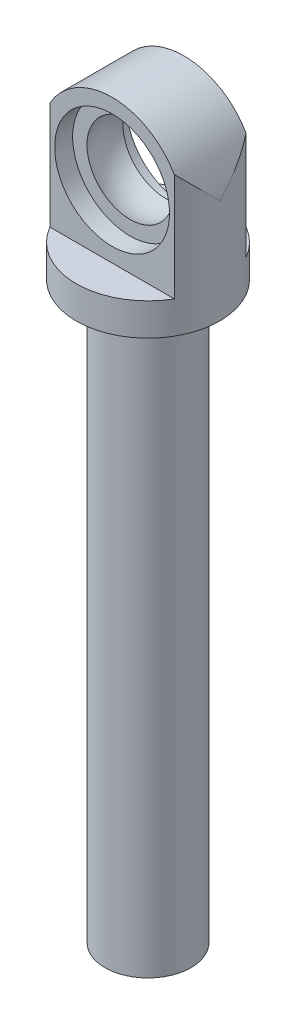
ISO-10303-21;
HEADER;
FILE_DESCRIPTION(('STEP AP214'),'2;1');
FILE_NAME('part.step','',(''),(''),'','','');
FILE_SCHEMA(('AUTOMOTIVE_DESIGN { 1 0 10303 214 1 1 1 1 }'));
ENDSEC;
DATA;
#1=APPLICATION_CONTEXT('core data for automotive mechanical design processes');
#2=APPLICATION_PROTOCOL_DEFINITION('international standard','automotive_design',2000,#1);
#3=PRODUCT_CONTEXT('',#1,'mechanical');
#4=PRODUCT('Part','Part','',(#3));
#5=PRODUCT_RELATED_PRODUCT_CATEGORY('part','',(#4));
#6=PRODUCT_DEFINITION_FORMATION('','',#4);
#7=PRODUCT_DEFINITION_CONTEXT('part definition',#1,'design');
#8=PRODUCT_DEFINITION('design','',#6,#7);
#9=PRODUCT_DEFINITION_SHAPE('','',#8);
#10=(LENGTH_UNIT() NAMED_UNIT(*) SI_UNIT(.MILLI.,.METRE.));
#11=(NAMED_UNIT(*) PLANE_ANGLE_UNIT() SI_UNIT($,.RADIAN.));
#12=(NAMED_UNIT(*) SI_UNIT($,.STERADIAN.) SOLID_ANGLE_UNIT());
#13=UNCERTAINTY_MEASURE_WITH_UNIT(LENGTH_MEASURE(1.E-05),#10,'distance_accuracy_value','');
#14=(GEOMETRIC_REPRESENTATION_CONTEXT(3) GLOBAL_UNCERTAINTY_ASSIGNED_CONTEXT((#13)) GLOBAL_UNIT_ASSIGNED_CONTEXT((#10,
#11,#12)) REPRESENTATION_CONTEXT('',''));
#15=CARTESIAN_POINT('',(0.,0.,0.));
#16=DIRECTION('',(0.,0.,1.));
#17=DIRECTION('',(1.,0.,0.));
#18=AXIS2_PLACEMENT_3D('',#15,#16,#17);
#19=CARTESIAN_POINT('',(0.,14.5,-5.));
#20=DIRECTION('',(0.,0.,1.));
#21=DIRECTION('',(1.,0.,0.));
#22=AXIS2_PLACEMENT_3D('',#19,#20,#21);
#23=CYLINDRICAL_SURFACE('',#22,8.);
#24=CARTESIAN_POINT('',(0.,14.5,-5.));
#25=DIRECTION('',(0.,0.,1.));
#26=DIRECTION('',(1.,0.,0.));
#27=AXIS2_PLACEMENT_3D('',#24,#25,#26);
#28=CIRCLE('',#27,8.);
#29=CARTESIAN_POINT('',(8.,14.5,-5.));
#30=VERTEX_POINT('',#29);
#31=EDGE_CURVE('E157',#30,#30,#28,.T.);
#32=ORIENTED_EDGE('',*,*,#31,.F.);
#33=EDGE_LOOP('',(#32));
#34=FACE_BOUND('',#33,.T.);
#35=CARTESIAN_POINT('',(0.,14.5,-2.5));
#36=DIRECTION('',(0.,0.,1.));
#37=DIRECTION('',(1.,0.,0.));
#38=AXIS2_PLACEMENT_3D('',#35,#36,#37);
#39=CIRCLE('',#38,8.);
#40=CARTESIAN_POINT('',(8.,14.5,-2.5));
#41=VERTEX_POINT('',#40);
#42=EDGE_CURVE('E107',#41,#41,#39,.F.);
#43=ORIENTED_EDGE('',*,*,#42,.F.);
#44=EDGE_LOOP('',(#43));
#45=FACE_BOUND('',#44,.T.);
#46=ADVANCED_FACE('F53',(#34,#45),#23,.F.);
#47=CARTESIAN_POINT('',(0.,4.5,0.));
#48=DIRECTION('',(0.,1.,0.));
#49=DIRECTION('',(0.,0.,1.));
#50=AXIS2_PLACEMENT_3D('',#47,#48,#49);
#51=PLANE('',#50);
#52=CARTESIAN_POINT('',(0.,4.5,0.));
#53=DIRECTION('',(0.,1.,0.));
#54=DIRECTION('',(0.,0.,1.));
#55=AXIS2_PLACEMENT_3D('',#52,#53,#54);
#56=CIRCLE('',#55,10.);
#57=CARTESIAN_POINT('',(8.66025403784439,4.5,-5.));
#58=VERTEX_POINT('',#57);
#59=CARTESIAN_POINT('',(-8.66025403784439,4.5,-5.));
#60=VERTEX_POINT('',#59);
#61=EDGE_CURVE('E111',#58,#60,#56,.T.);
#62=ORIENTED_EDGE('',*,*,#61,.T.);
#63=DIRECTION('',(1.,0.,0.));
#64=VECTOR('',#63,1.);
#65=CARTESIAN_POINT('',(-9.99999999999998,4.5,-5.));
#66=LINE('',#65,#64);
#67=EDGE_CURVE('E108',#60,#58,#66,.T.);
#68=ORIENTED_EDGE('',*,*,#67,.T.);
#69=EDGE_LOOP('',(#62,#68));
#70=FACE_BOUND('',#69,.T.);
#71=ADVANCED_FACE('F127',(#70),#51,.T.);
#72=CARTESIAN_POINT('',(0.,4.5,0.));
#73=DIRECTION('',(0.,-1.,0.));
#74=DIRECTION('',(0.,0.,-1.));
#75=AXIS2_PLACEMENT_3D('',#72,#73,#74);
#76=CYLINDRICAL_SURFACE('',#75,10.);
#77=DIRECTION('',(0.,-1.,0.));
#78=VECTOR('',#77,1.);
#79=CARTESIAN_POINT('',(8.66025403784439,22.5,5.));
#80=LINE('',#79,#78);
#81=CARTESIAN_POINT('',(8.66025403784439,4.5,5.));
#82=VERTEX_POINT('',#81);
#83=CARTESIAN_POINT('',(8.66025403784439,19.5,5.));
#84=VERTEX_POINT('',#83);
#85=EDGE_CURVE('E57',#82,#84,#80,.F.);
#86=ORIENTED_EDGE('',*,*,#85,.F.);
#87=CARTESIAN_POINT('',(-8.66025403784439,4.5,5.));
#88=VERTEX_POINT('',#87);
#89=EDGE_CURVE('E102',#88,#82,#56,.T.);
#90=ORIENTED_EDGE('',*,*,#89,.F.);
#91=DIRECTION('',(0.,-1.,0.));
#92=VECTOR('',#91,1.);
#93=CARTESIAN_POINT('',(-8.66025403784439,22.5,5.));
#94=LINE('',#93,#92);
#95=CARTESIAN_POINT('',(-8.66025403784439,19.5,5.));
#96=VERTEX_POINT('',#95);
#97=EDGE_CURVE('E77',#96,#88,#94,.T.);
#98=ORIENTED_EDGE('',*,*,#97,.F.);
#99=CARTESIAN_POINT('',(0.,14.5,0.));
#100=DIRECTION('',(0.,-0.707106781186547,0.707106781186547));
#101=DIRECTION('',(0.,0.707106781186547,0.707106781186547));
#102=AXIS2_PLACEMENT_3D('',#99,#100,#101);
#103=ELLIPSE('',#102,14.1421356237309,9.99999999999999);
#104=CARTESIAN_POINT('',(-9.99999999999999,14.5,0.));
#105=VERTEX_POINT('',#104);
#106=EDGE_CURVE('E173',#96,#105,#103,.T.);
#107=ORIENTED_EDGE('',*,*,#106,.T.);
#108=CARTESIAN_POINT('',(0.,14.5,0.));
#109=DIRECTION('',(0.,0.707106781186547,0.707106781186547));
#110=DIRECTION('',(0.,-0.707106781186547,0.707106781186547));
#111=AXIS2_PLACEMENT_3D('',#108,#109,#110);
#112=ELLIPSE('',#111,14.1421356237309,9.99999999999999);
#113=CARTESIAN_POINT('',(-8.66025403784439,19.5,-5.));
#114=VERTEX_POINT('',#113);
#115=EDGE_CURVE('E174',#105,#114,#112,.F.);
#116=ORIENTED_EDGE('',*,*,#115,.T.);
#117=DIRECTION('',(0.,-1.,0.));
#118=VECTOR('',#117,1.);
#119=CARTESIAN_POINT('',(-8.66025403784439,22.5,-5.));
#120=LINE('',#119,#118);
#121=EDGE_CURVE('E177',#114,#60,#120,.T.);
#122=ORIENTED_EDGE('',*,*,#121,.T.);
#123=ORIENTED_EDGE('',*,*,#61,.F.);
#124=DIRECTION('',(0.,-1.,0.));
#125=VECTOR('',#124,1.);
#126=CARTESIAN_POINT('',(8.66025403784439,22.5,-5.));
#127=LINE('',#126,#125);
#128=CARTESIAN_POINT('',(8.66025403784439,19.5,-5.));
#129=VERTEX_POINT('',#128);
#130=EDGE_CURVE('E184',#58,#129,#127,.F.);
#131=ORIENTED_EDGE('',*,*,#130,.T.);
#132=CARTESIAN_POINT('',(9.99999999999999,14.5,0.));
#133=VERTEX_POINT('',#132);
#134=EDGE_CURVE('E161',#129,#133,#112,.F.);
#135=ORIENTED_EDGE('',*,*,#134,.T.);
#136=EDGE_CURVE('E69',#133,#84,#103,.T.);
#137=ORIENTED_EDGE('',*,*,#136,.T.);
#138=EDGE_LOOP('',(#86,#90,#98,#107,#116,#122,#123,#131,#135,#137));
#139=FACE_BOUND('',#138,.T.);
#140=CARTESIAN_POINT('',(0.,0.,0.));
#141=DIRECTION('',(0.,1.,0.));
#142=DIRECTION('',(0.,0.,1.));
#143=AXIS2_PLACEMENT_3D('',#140,#141,#142);
#144=CIRCLE('',#143,10.);
#145=CARTESIAN_POINT('',(0.,0.,10.));
#146=VERTEX_POINT('',#145);
#147=EDGE_CURVE('E112',#146,#146,#144,.T.);
#148=ORIENTED_EDGE('',*,*,#147,.T.);
#149=EDGE_LOOP('',(#148));
#150=FACE_BOUND('',#149,.T.);
#151=ADVANCED_FACE('F55',(#139,#150),#76,.T.);
#152=DIRECTION('',(1.,0.,0.));
#153=VECTOR('',#152,1.);
#154=CARTESIAN_POINT('',(-9.99999999999998,4.5,5.));
#155=LINE('',#154,#153);
#156=EDGE_CURVE('E104',#88,#82,#155,.T.);
#157=ORIENTED_EDGE('',*,*,#156,.F.);
#158=ORIENTED_EDGE('',*,*,#89,.T.);
#159=EDGE_LOOP('',(#157,#158));
#160=FACE_BOUND('',#159,.T.);
#161=ADVANCED_FACE('F110',(#160),#51,.T.);
#162=CARTESIAN_POINT('',(0.,0.,0.));
#163=DIRECTION('',(0.,1.,0.));
#164=DIRECTION('',(0.,0.,1.));
#165=AXIS2_PLACEMENT_3D('',#162,#163,#164);
#166=PLANE('',#165);
#167=CARTESIAN_POINT('',(0.,0.,0.));
#168=DIRECTION('',(0.,-1.,0.));
#169=DIRECTION('',(0.,0.,-1.));
#170=AXIS2_PLACEMENT_3D('',#167,#168,#169);
#171=CIRCLE('',#170,6.);
#172=CARTESIAN_POINT('',(0.,0.,-6.));
#173=VERTEX_POINT('',#172);
#174=EDGE_CURVE('E12',#173,#173,#171,.T.);
#175=ORIENTED_EDGE('',*,*,#174,.F.);
#176=EDGE_LOOP('',(#175));
#177=FACE_BOUND('',#176,.T.);
#178=ORIENTED_EDGE('',*,*,#147,.F.);
#179=EDGE_LOOP('',(#178));
#180=FACE_BOUND('',#179,.T.);
#181=ADVANCED_FACE('F194',(#177,#180),#166,.F.);
#182=CARTESIAN_POINT('',(0.,14.5,-5.));
#183=DIRECTION('',(0.,0.,1.));
#184=DIRECTION('',(1.,0.,0.));
#185=AXIS2_PLACEMENT_3D('',#182,#183,#184);
#186=CYLINDRICAL_SURFACE('',#185,9.99999999999998);
#187=ORIENTED_EDGE('',*,*,#106,.F.);
#188=CARTESIAN_POINT('',(0.,14.5,5.));
#189=DIRECTION('',(0.,0.,1.));
#190=DIRECTION('',(-1.,0.,0.));
#191=AXIS2_PLACEMENT_3D('',#188,#189,#190);
#192=CIRCLE('',#191,9.99999999999998);
#193=EDGE_CURVE('E119',#84,#96,#192,.T.);
#194=ORIENTED_EDGE('',*,*,#193,.F.);
#195=ORIENTED_EDGE('',*,*,#136,.F.);
#196=ORIENTED_EDGE('',*,*,#134,.F.);
#197=CARTESIAN_POINT('',(0.,14.5,-5.));
#198=DIRECTION('',(0.,0.,1.));
#199=DIRECTION('',(-1.,0.,0.));
#200=AXIS2_PLACEMENT_3D('',#197,#198,#199);
#201=CIRCLE('',#200,9.99999999999998);
#202=EDGE_CURVE('E116',#129,#114,#201,.T.);
#203=ORIENTED_EDGE('',*,*,#202,.T.);
#204=ORIENTED_EDGE('',*,*,#115,.F.);
#205=EDGE_LOOP('',(#187,#194,#195,#196,#203,#204));
#206=FACE_BOUND('',#205,.T.);
#207=ADVANCED_FACE('F172',(#206),#186,.T.);
#208=CARTESIAN_POINT('',(0.,14.5,-5.));
#209=DIRECTION('',(0.,0.,-1.));
#210=DIRECTION('',(-1.,0.,0.));
#211=AXIS2_PLACEMENT_3D('',#208,#209,#210);
#212=PLANE('',#211);
#213=ORIENTED_EDGE('',*,*,#130,.F.);
#214=ORIENTED_EDGE('',*,*,#67,.F.);
#215=ORIENTED_EDGE('',*,*,#121,.F.);
#216=ORIENTED_EDGE('',*,*,#202,.F.);
#217=EDGE_LOOP('',(#213,#214,#215,#216));
#218=FACE_BOUND('',#217,.T.);
#219=ORIENTED_EDGE('',*,*,#31,.T.);
#220=EDGE_LOOP('',(#219));
#221=FACE_BOUND('',#220,.T.);
#222=ADVANCED_FACE('F147',(#218,#221),#212,.T.);
#223=CARTESIAN_POINT('',(0.,14.5,5.));
#224=DIRECTION('',(0.,0.,-1.));
#225=DIRECTION('',(-1.,0.,0.));
#226=AXIS2_PLACEMENT_3D('',#223,#224,#225);
#227=PLANE('',#226);
#228=CARTESIAN_POINT('',(0.,14.5,5.));
#229=DIRECTION('',(0.,0.,1.));
#230=DIRECTION('',(1.,0.,0.));
#231=AXIS2_PLACEMENT_3D('',#228,#229,#230);
#232=CIRCLE('',#231,8.);
#233=CARTESIAN_POINT('',(8.,14.5,5.));
#234=VERTEX_POINT('',#233);
#235=EDGE_CURVE('E156',#234,#234,#232,.T.);
#236=ORIENTED_EDGE('',*,*,#235,.F.);
#237=EDGE_LOOP('',(#236));
#238=FACE_BOUND('',#237,.T.);
#239=ORIENTED_EDGE('',*,*,#156,.T.);
#240=ORIENTED_EDGE('',*,*,#85,.T.);
#241=ORIENTED_EDGE('',*,*,#193,.T.);
#242=ORIENTED_EDGE('',*,*,#97,.T.);
#243=EDGE_LOOP('',(#239,#240,#241,#242));
#244=FACE_BOUND('',#243,.T.);
#245=ADVANCED_FACE('F105',(#238,#244),#227,.F.);
#246=CARTESIAN_POINT('',(0.,14.5,2.5));
#247=DIRECTION('',(0.,0.,1.));
#248=DIRECTION('',(1.,0.,0.));
#249=AXIS2_PLACEMENT_3D('',#246,#247,#248);
#250=CIRCLE('',#249,8.);
#251=CARTESIAN_POINT('',(8.,14.5,2.5));
#252=VERTEX_POINT('',#251);
#253=EDGE_CURVE('E153',#252,#252,#250,.T.);
#254=ORIENTED_EDGE('',*,*,#253,.F.);
#255=EDGE_LOOP('',(#254));
#256=FACE_BOUND('',#255,.T.);
#257=ORIENTED_EDGE('',*,*,#235,.T.);
#258=EDGE_LOOP('',(#257));
#259=FACE_BOUND('',#258,.T.);
#260=ADVANCED_FACE('F130',(#256,#259),#23,.F.);
#261=CARTESIAN_POINT('',(0.,14.5,-2.5));
#262=DIRECTION('',(0.,0.,1.));
#263=DIRECTION('',(1.,0.,0.));
#264=AXIS2_PLACEMENT_3D('',#261,#262,#263);
#265=PLANE('',#264);
#266=CARTESIAN_POINT('',(0.,14.5,-2.49999999999999));
#267=DIRECTION('',(0.,0.,1.));
#268=DIRECTION('',(1.,0.,0.));
#269=AXIS2_PLACEMENT_3D('',#266,#267,#268);
#270=CIRCLE('',#269,6.);
#271=CARTESIAN_POINT('',(6.,14.5,-2.49999999999999));
#272=VERTEX_POINT('',#271);
#273=EDGE_CURVE('E289',#272,#272,#270,.T.);
#274=ORIENTED_EDGE('',*,*,#273,.T.);
#275=EDGE_LOOP('',(#274));
#276=FACE_BOUND('',#275,.T.);
#277=ORIENTED_EDGE('',*,*,#42,.T.);
#278=EDGE_LOOP('',(#277));
#279=FACE_BOUND('',#278,.T.);
#280=ADVANCED_FACE('F124',(#276,#279),#265,.F.);
#281=CARTESIAN_POINT('',(0.,14.5,2.5));
#282=DIRECTION('',(0.,0.,1.));
#283=DIRECTION('',(1.,0.,0.));
#284=AXIS2_PLACEMENT_3D('',#281,#282,#283);
#285=PLANE('',#284);
#286=CARTESIAN_POINT('',(0.,14.5,2.49999999999999));
#287=DIRECTION('',(0.,0.,-1.));
#288=DIRECTION('',(-1.,0.,0.));
#289=AXIS2_PLACEMENT_3D('',#286,#287,#288);
#290=CIRCLE('',#289,6.);
#291=CARTESIAN_POINT('',(-6.,14.5,2.49999999999999));
#292=VERTEX_POINT('',#291);
#293=EDGE_CURVE('E179',#292,#292,#290,.T.);
#294=ORIENTED_EDGE('',*,*,#293,.T.);
#295=EDGE_LOOP('',(#294));
#296=FACE_BOUND('',#295,.T.);
#297=ORIENTED_EDGE('',*,*,#253,.T.);
#298=EDGE_LOOP('',(#297));
#299=FACE_BOUND('',#298,.T.);
#300=ADVANCED_FACE('F145',(#296,#299),#285,.T.);
#301=CARTESIAN_POINT('',(0.,-80.,0.));
#302=DIRECTION('',(0.,1.,0.));
#303=DIRECTION('',(0.,0.,1.));
#304=AXIS2_PLACEMENT_3D('',#301,#302,#303);
#305=CYLINDRICAL_SURFACE('',#304,6.);
#306=CARTESIAN_POINT('',(0.,-80.,0.));
#307=DIRECTION('',(0.,-1.,0.));
#308=DIRECTION('',(0.,0.,-1.));
#309=AXIS2_PLACEMENT_3D('',#306,#307,#308);
#310=CIRCLE('',#309,6.);
#311=CARTESIAN_POINT('',(0.,-80.,-6.));
#312=VERTEX_POINT('',#311);
#313=EDGE_CURVE('E175',#312,#312,#310,.T.);
#314=ORIENTED_EDGE('',*,*,#313,.F.);
#315=EDGE_LOOP('',(#314));
#316=FACE_BOUND('',#315,.T.);
#317=ORIENTED_EDGE('',*,*,#174,.T.);
#318=EDGE_LOOP('',(#317));
#319=FACE_BOUND('',#318,.T.);
#320=ADVANCED_FACE('F241',(#316,#319),#305,.T.);
#321=CARTESIAN_POINT('',(0.,-80.,0.));
#322=DIRECTION('',(0.,-1.,0.));
#323=DIRECTION('',(0.,0.,-1.));
#324=AXIS2_PLACEMENT_3D('',#321,#322,#323);
#325=PLANE('',#324);
#326=ORIENTED_EDGE('',*,*,#313,.T.);
#327=EDGE_LOOP('',(#326));
#328=FACE_BOUND('',#327,.T.);
#329=ADVANCED_FACE('F247',(#328),#325,.T.);
#330=CARTESIAN_POINT('',(0.,14.5,0.));
#331=DIRECTION('',(0.,-1.,0.));
#332=DIRECTION('',(-1.,0.,0.));
#333=AXIS2_PLACEMENT_3D('',#330,#331,#332);
#334=SPHERICAL_SURFACE('',#333,6.5);
#335=CARTESIAN_POINT('',(0.,14.5,0.));
#336=DIRECTION('',(0.,0.,1.));
#337=DIRECTION('',(1.,0.,0.));
#338=AXIS2_PLACEMENT_3D('',#335,#336,#337);
#339=SPHERICAL_SURFACE('',#338,6.5);
#340=ORIENTED_EDGE('',*,*,#273,.F.);
#341=EDGE_LOOP('',(#340));
#342=FACE_BOUND('',#341,.T.);
#343=ORIENTED_EDGE('',*,*,#293,.F.);
#344=EDGE_LOOP('',(#343));
#345=FACE_BOUND('',#344,.T.);
#346=ADVANCED_FACE('F257',(#342,#345),#339,.F.);
#347=CLOSED_SHELL('',(#46,#71,#151,#161,#181,#207,#222,#245,#260,#280,#300,#320,#329,#346));
#348=MANIFOLD_SOLID_BREP('B2',#347);
#349=ADVANCED_BREP_SHAPE_REPRESENTATION('',(#18,#348),#14);
#350=SHAPE_DEFINITION_REPRESENTATION(#9,#349);
ENDSEC;
END-ISO-10303-21;
